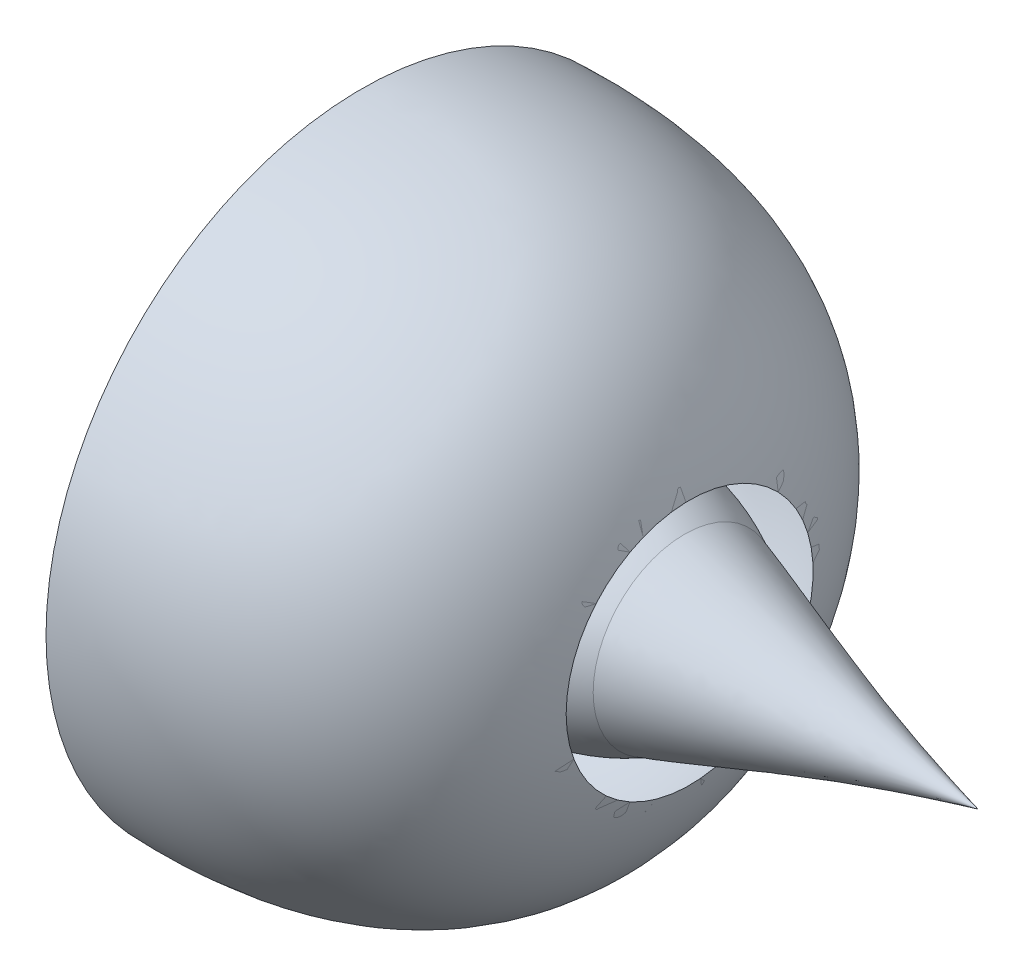
ISO-10303-21;
HEADER;
FILE_DESCRIPTION(('STEP AP214'),'2;1');
FILE_NAME('part.step','',(''),(''),'','','');
FILE_SCHEMA(('AUTOMOTIVE_DESIGN { 1 0 10303 214 1 1 1 1 }'));
ENDSEC;
DATA;
#1=APPLICATION_CONTEXT('core data for automotive mechanical design processes');
#2=APPLICATION_PROTOCOL_DEFINITION('international standard','automotive_design',2000,#1);
#3=PRODUCT_CONTEXT('',#1,'mechanical');
#4=PRODUCT('Part','Part','',(#3));
#5=PRODUCT_RELATED_PRODUCT_CATEGORY('part','',(#4));
#6=PRODUCT_DEFINITION_FORMATION('','',#4);
#7=PRODUCT_DEFINITION_CONTEXT('part definition',#1,'design');
#8=PRODUCT_DEFINITION('design','',#6,#7);
#9=PRODUCT_DEFINITION_SHAPE('','',#8);
#10=(LENGTH_UNIT() NAMED_UNIT(*) SI_UNIT(.MILLI.,.METRE.));
#11=(NAMED_UNIT(*) PLANE_ANGLE_UNIT() SI_UNIT($,.RADIAN.));
#12=(NAMED_UNIT(*) SI_UNIT($,.STERADIAN.) SOLID_ANGLE_UNIT());
#13=UNCERTAINTY_MEASURE_WITH_UNIT(LENGTH_MEASURE(1.E-05),#10,'distance_accuracy_value','');
#14=(GEOMETRIC_REPRESENTATION_CONTEXT(3) GLOBAL_UNCERTAINTY_ASSIGNED_CONTEXT((#13)) GLOBAL_UNIT_ASSIGNED_CONTEXT((#10,
#11,#12)) REPRESENTATION_CONTEXT('',''));
#15=CARTESIAN_POINT('',(0.,0.,0.));
#16=DIRECTION('',(0.,0.,1.));
#17=DIRECTION('',(1.,0.,0.));
#18=AXIS2_PLACEMENT_3D('',#15,#16,#17);
#19=CARTESIAN_POINT('',(-324.102934747397,266.867099031823,0.));
#20=CARTESIAN_POINT('',(-209.902256910009,277.366784471204,0.));
#21=CARTESIAN_POINT('',(-60.7334219943067,238.454880091208,0.));
#22=CARTESIAN_POINT('',(-21.2612640312048,113.998473668144,0.));
#23=B_SPLINE_CURVE_WITH_KNOTS('',3,(#19,#20,#21,#22),.UNSPECIFIED.,.F.,.F.,(4,4),(0.,1.),.UNSPECIFIED.);
#24=CARTESIAN_POINT('',(-324.102934747397,0.,0.));
#25=DIRECTION('',(-1.,0.,0.));
#26=AXIS1_PLACEMENT('',#24,#25);
#27=SURFACE_OF_REVOLUTION('',#23,#26);
#28=CARTESIAN_POINT('',(-21.2612640312048,0.,0.));
#29=DIRECTION('',(-1.,0.,0.));
#30=DIRECTION('',(0.,0.,1.));
#31=AXIS2_PLACEMENT_3D('',#28,#29,#30);
#32=CIRCLE('',#31,113.998473668144);
#33=CARTESIAN_POINT('',(-21.2612640312048,0.,113.998473668144));
#34=VERTEX_POINT('',#33);
#35=EDGE_CURVE('E52',#34,#34,#32,.T.);
#36=ORIENTED_EDGE('',*,*,#35,.F.);
#37=EDGE_LOOP('',(#36));
#38=FACE_BOUND('',#37,.T.);
#39=CARTESIAN_POINT('',(-324.102934747397,0.,0.));
#40=DIRECTION('',(-1.,0.,0.));
#41=DIRECTION('',(0.,0.,1.));
#42=AXIS2_PLACEMENT_3D('',#39,#40,#41);
#43=CIRCLE('',#42,266.867099031823);
#44=CARTESIAN_POINT('',(-324.102934747397,0.,266.867099031823));
#45=VERTEX_POINT('',#44);
#46=EDGE_CURVE('E11',#45,#45,#43,.T.);
#47=ORIENTED_EDGE('',*,*,#46,.T.);
#48=EDGE_LOOP('',(#47));
#49=FACE_BOUND('',#48,.T.);
#50=ADVANCED_FACE('F41',(#38,#49),#27,.T.);
#51=CARTESIAN_POINT('',(-324.102934747397,291.340519345992,0.));
#52=DIRECTION('',(1.,0.,0.));
#53=DIRECTION('',(0.,0.,-1.));
#54=AXIS2_PLACEMENT_3D('',#51,#52,#53);
#55=PLANE('',#54);
#56=ORIENTED_EDGE('',*,*,#46,.F.);
#57=EDGE_LOOP('',(#56));
#58=FACE_BOUND('',#57,.T.);
#59=CARTESIAN_POINT('',(-324.102934747397,0.,0.));
#60=DIRECTION('',(-1.,0.,0.));
#61=DIRECTION('',(0.,0.,1.));
#62=AXIS2_PLACEMENT_3D('',#59,#60,#61);
#63=CIRCLE('',#62,291.340519345992);
#64=CARTESIAN_POINT('',(-324.102934747397,0.,291.340519345992));
#65=VERTEX_POINT('',#64);
#66=EDGE_CURVE('E48',#65,#65,#63,.T.);
#67=ORIENTED_EDGE('',*,*,#66,.T.);
#68=EDGE_LOOP('',(#67));
#69=FACE_BOUND('',#68,.T.);
#70=ADVANCED_FACE('F70',(#58,#69),#55,.F.);
#71=CARTESIAN_POINT('',(-21.2612640312048,113.998473668144,0.));
#72=CARTESIAN_POINT('',(-79.4303619077677,299.11956447635,0.));
#73=CARTESIAN_POINT('',(-324.102934747397,291.340519345992,0.));
#74=B_SPLINE_CURVE_WITH_KNOTS('',2,(#71,#72,#73),.UNSPECIFIED.,.F.,.F.,(3,3),(0.,1.),.UNSPECIFIED.);
#75=CARTESIAN_POINT('',(-324.102934747397,0.,0.));
#76=DIRECTION('',(-1.,0.,0.));
#77=AXIS1_PLACEMENT('',#75,#76);
#78=SURFACE_OF_REVOLUTION('',#74,#77);
#79=ORIENTED_EDGE('',*,*,#66,.F.);
#80=EDGE_LOOP('',(#79));
#81=FACE_BOUND('',#80,.T.);
#82=ORIENTED_EDGE('',*,*,#35,.T.);
#83=EDGE_LOOP('',(#82));
#84=FACE_BOUND('',#83,.T.);
#85=ADVANCED_FACE('F68',(#81,#84),#78,.T.);
#86=CLOSED_SHELL('',(#50,#70,#85));
#87=MANIFOLD_SOLID_BREP('B2',#86);
#88=CARTESIAN_POINT('',(-26.1831993874,84.4430566476,0.));
#89=CARTESIAN_POINT('',(-19.1133062200707,82.1460051247389,0.));
#90=CARTESIAN_POINT('',(-8.94763197266018,78.8431153980834,0.));
#91=CARTESIAN_POINT('',(3.63827359158915,74.5900061446757,0.));
#92=CARTESIAN_POINT('',(11.3222206659608,71.9661686732699,0.));
#93=CARTESIAN_POINT('',(17.8761868432433,69.7088366293041,0.));
#94=CARTESIAN_POINT('',(23.7978629434186,67.6581230543529,0.));
#95=CARTESIAN_POINT('',(29.3067443212977,65.7432960261919,0.));
#96=CARTESIAN_POINT('',(34.5251775173137,63.9254776245125,0.));
#97=CARTESIAN_POINT('',(39.5302056427811,62.1803224754006,0.));
#98=CARTESIAN_POINT('',(44.3743348995618,60.4914012399904,0.));
#99=CARTESIAN_POINT('',(49.0954011604656,58.8469905091219,0.));
#100=CARTESIAN_POINT('',(53.7218483075038,57.2383809042886,0.));
#101=CARTESIAN_POINT('',(58.2757885498715,55.6588929354462,0.));
#102=CARTESIAN_POINT('',(62.7748917332012,54.1032721734409,0.));
#103=CARTESIAN_POINT('',(67.2336096105082,52.5672977077683,0.));
#104=CARTESIAN_POINT('',(71.664001234428,51.0475187920747,0.));
#105=CARTESIAN_POINT('',(76.0763079192904,49.5410717370594,0.));
#106=CARTESIAN_POINT('',(80.4793649947478,48.0455490688676,0.));
#107=CARTESIAN_POINT('',(84.8809037620142,46.5589038065522,0.));
#108=CARTESIAN_POINT('',(89.2877775552963,45.0793779935333,0.));
#109=CARTESIAN_POINT('',(93.706134094691,43.6054483810212,0.));
#110=CARTESIAN_POINT('',(98.1415490425133,42.1357844934964,0.));
#111=CARTESIAN_POINT('',(102.599131022132,40.6692158016023,0.));
#112=CARTESIAN_POINT('',(107.083605306941,39.2047056954456,0.));
#113=CARTESIAN_POINT('',(111.599381336118,37.7413306303374,0.));
#114=CARTESIAN_POINT('',(116.150607806644,36.2782632233023,0.));
#115=CARTESIAN_POINT('',(120.741218117135,34.814758451602,0.));
#116=CARTESIAN_POINT('',(125.374968237063,33.3501422636419,0.));
#117=CARTESIAN_POINT('',(130.055468575315,31.8838021253723,0.));
#118=CARTESIAN_POINT('',(134.786211055879,30.4151791062723,0.));
#119=CARTESIAN_POINT('',(139.570592337451,28.9437612133235,0.));
#120=CARTESIAN_POINT('',(144.411933911515,27.4690777461354,0.));
#121=CARTESIAN_POINT('',(149.313499658224,25.9906944795248,0.));
#122=CARTESIAN_POINT('',(154.278511323436,24.5082095420314,0.));
#123=CARTESIAN_POINT('',(159.310162290784,23.0212498627809,0.));
#124=CARTESIAN_POINT('',(164.411629949038,21.5294680998986,0.));
#125=CARTESIAN_POINT('',(169.586086905673,20.0325399691406,0.));
#126=CARTESIAN_POINT('',(174.836711247453,18.5301619198601,0.));
#127=CARTESIAN_POINT('',(180.166696018981,17.0220490857281,0.));
#128=CARTESIAN_POINT('',(185.579258066515,15.5079335125301,0.));
#129=CARTESIAN_POINT('',(191.077646343856,13.9875625139182,0.));
#130=CARTESIAN_POINT('',(196.665149873414,12.460697503417,0.));
#131=CARTESIAN_POINT('',(202.345105103392,10.9271118636122,0.));
#132=CARTESIAN_POINT('',(208.120904069641,9.38659325087045,0.));
#133=CARTESIAN_POINT('',(213.995998331764,7.83892955243911,0.));
#134=CARTESIAN_POINT('',(219.973918234735,6.28395795058755,0.));
#135=CARTESIAN_POINT('',(226.058232992311,4.72137299405137,0.));
#136=CARTESIAN_POINT('',(232.252736990295,3.15145759298977,0.));
#137=CARTESIAN_POINT('',(238.560769716994,1.57228004205892,0.));
#138=CARTESIAN_POINT('',(242.807039437986,0.527178077687417,0.));
#139=CARTESIAN_POINT('',(244.948974278,0.,0.));
#140=B_SPLINE_CURVE_WITH_KNOTS('',3,(#88,#89,#90,#91,#92,#93,#94,#95,#96,#97,#98,#99,#100,#101,
#102,#103,#104,#105,#106,#107,#108,#109,#110,#111,#112,#113,#114,#115,#116,#117,#118,#119,#120,
#121,#122,#123,#124,#125,#126,#127,#128,#129,#130,#131,#132,#133,#134,#135,#136,#137,#138,#139),
.UNSPECIFIED.,.F.,.F.,(4,1,1,1,1,1,1,1,1,1,1,1,1,1,1,1,1,1,1,1,1,1,1,1,1,1,1,1,1,1,1,1,1,1,1,1,
1,1,1,1,1,1,1,1,1,1,1,1,1,4),(0.,0.0784951510122607,0.112866788267661,0.14028291237511,
0.164233954154644,0.186063244502965,0.206456306325543,0.225818920945263,0.244414937527279,
0.262427561324297,0.279990385488118,0.29720462377808,0.314149369551614,0.330888044931569,
0.347472636914896,0.363946582449941,0.380346794104435,0.396705119776174,0.413049418517314,
0.429404369216508,0.445792089198798,0.462232614885231,0.478744280603098,0.495344021006775,
0.51204761545452,0.528869887622101,0.545824870359715,0.562925943140808,0.580185947817305,
0.597617286977438,0.615232008313732,0.633041877655038,0.651058442718228,0.669293089318114,
0.687757091326428,0.706461655520502,0.725417962191423,0.744637202287047,0.76413061163976,
0.783909502900108,0.803985295506676,0.824369544119733,0.845073965866707,0.866110466586989,
0.887491166423122,0.909228424885207,0.931334865666995,0.953823401303265,0.976707257889686,1.),.UNSPECIFIED.);
#141=CARTESIAN_POINT('',(-324.102934747397,0.,0.));
#142=DIRECTION('',(-1.,0.,0.));
#143=AXIS1_PLACEMENT('',#141,#142);
#144=SURFACE_OF_REVOLUTION('',#140,#143);
#145=CARTESIAN_POINT('',(244.948974278,0.,0.));
#146=VERTEX_POINT('',#145);
#147=VERTEX_LOOP('',#146);
#148=FACE_BOUND('',#147,.T.);
#149=CARTESIAN_POINT('',(-25.9491263869009,0.,0.));
#150=DIRECTION('',(-1.,0.,0.));
#151=DIRECTION('',(0.,0.,1.));
#152=AXIS2_PLACEMENT_3D('',#149,#150,#151);
#153=CIRCLE('',#152,84.3670048126506);
#154=CARTESIAN_POINT('',(-25.9491263869009,0.,84.3670048126506));
#155=VERTEX_POINT('',#154);
#156=EDGE_CURVE('E39',#155,#155,#153,.T.);
#157=ORIENTED_EDGE('',*,*,#156,.F.);
#158=EDGE_LOOP('',(#157));
#159=FACE_BOUND('',#158,.T.);
#160=ADVANCED_FACE('F102',(#148,#159),#144,.F.);
#161=CARTESIAN_POINT('',(-25.949126386901,84.3670048126506,0.));
#162=CARTESIAN_POINT('',(-87.2773747046662,117.089551667289,0.));
#163=CARTESIAN_POINT('',(-167.798353056408,119.164195992217,0.));
#164=CARTESIAN_POINT('',(-228.654742718923,84.3670048126506,0.));
#165=B_SPLINE_CURVE_WITH_KNOTS('',3,(#161,#162,#163,#164),.UNSPECIFIED.,.F.,.F.,(4,4),(0.,1.),.UNSPECIFIED.);
#166=CARTESIAN_POINT('',(-324.102934747397,0.,0.));
#167=DIRECTION('',(-1.,0.,0.));
#168=AXIS1_PLACEMENT('',#166,#167);
#169=SURFACE_OF_REVOLUTION('',#165,#168);
#170=CARTESIAN_POINT('',(-228.654742718923,0.,0.));
#171=DIRECTION('',(-1.,0.,0.));
#172=DIRECTION('',(0.,0.,1.));
#173=AXIS2_PLACEMENT_3D('',#170,#171,#172);
#174=CIRCLE('',#173,84.3670048126506);
#175=CARTESIAN_POINT('',(-228.654742718923,0.,84.3670048126506));
#176=VERTEX_POINT('',#175);
#177=EDGE_CURVE('E110',#176,#176,#174,.T.);
#178=ORIENTED_EDGE('',*,*,#177,.F.);
#179=EDGE_LOOP('',(#178));
#180=FACE_BOUND('',#179,.T.);
#181=ORIENTED_EDGE('',*,*,#156,.T.);
#182=EDGE_LOOP('',(#181));
#183=FACE_BOUND('',#182,.T.);
#184=ADVANCED_FACE('F119',(#180,#183),#169,.T.);
#185=CARTESIAN_POINT('',(-228.654742718923,84.3670048126506,0.));
#186=CARTESIAN_POINT('',(-289.460151276641,57.1437817614229,0.));
#187=CARTESIAN_POINT('',(-324.102934747397,0.,0.));
#188=B_SPLINE_CURVE_WITH_KNOTS('',2,(#185,#186,#187),.UNSPECIFIED.,.F.,.F.,(3,3),(0.,1.),.UNSPECIFIED.);
#189=CARTESIAN_POINT('',(-324.102934747397,0.,0.));
#190=DIRECTION('',(-1.,0.,0.));
#191=AXIS1_PLACEMENT('',#189,#190);
#192=SURFACE_OF_REVOLUTION('',#188,#191);
#193=CARTESIAN_POINT('',(-324.102934747397,0.,0.));
#194=VERTEX_POINT('',#193);
#195=VERTEX_LOOP('',#194);
#196=FACE_BOUND('',#195,.T.);
#197=ORIENTED_EDGE('',*,*,#177,.T.);
#198=EDGE_LOOP('',(#197));
#199=FACE_BOUND('',#198,.T.);
#200=ADVANCED_FACE('F116',(#196,#199),#192,.T.);
#201=CLOSED_SHELL('',(#160,#184,#200));
#202=MANIFOLD_SOLID_BREP('B6',#201);
#203=ADVANCED_BREP_SHAPE_REPRESENTATION('',(#18,#87,#202),#14);
#204=SHAPE_DEFINITION_REPRESENTATION(#9,#203);
ENDSEC;
END-ISO-10303-21;
